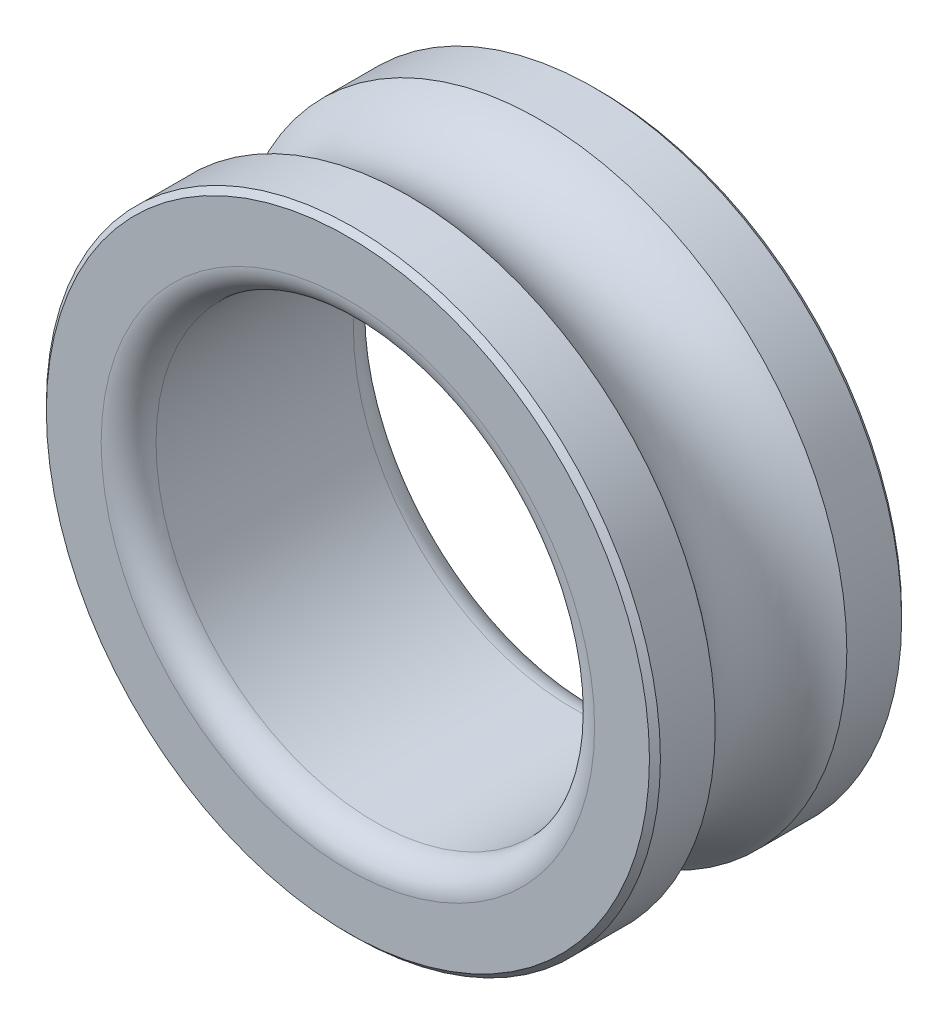
ISO-10303-21;
HEADER;
FILE_DESCRIPTION(('STEP AP214'),'2;1');
FILE_NAME('part.step','',(''),(''),'','','');
FILE_SCHEMA(('AUTOMOTIVE_DESIGN { 1 0 10303 214 1 1 1 1 }'));
ENDSEC;
DATA;
#1=APPLICATION_CONTEXT('core data for automotive mechanical design processes');
#2=APPLICATION_PROTOCOL_DEFINITION('international standard','automotive_design',2000,#1);
#3=PRODUCT_CONTEXT('',#1,'mechanical');
#4=PRODUCT('Part','Part','',(#3));
#5=PRODUCT_RELATED_PRODUCT_CATEGORY('part','',(#4));
#6=PRODUCT_DEFINITION_FORMATION('','',#4);
#7=PRODUCT_DEFINITION_CONTEXT('part definition',#1,'design');
#8=PRODUCT_DEFINITION('design','',#6,#7);
#9=PRODUCT_DEFINITION_SHAPE('','',#8);
#10=(LENGTH_UNIT() NAMED_UNIT(*) SI_UNIT(.MILLI.,.METRE.));
#11=(NAMED_UNIT(*) PLANE_ANGLE_UNIT() SI_UNIT($,.RADIAN.));
#12=(NAMED_UNIT(*) SI_UNIT($,.STERADIAN.) SOLID_ANGLE_UNIT());
#13=UNCERTAINTY_MEASURE_WITH_UNIT(LENGTH_MEASURE(1.E-05),#10,'distance_accuracy_value','');
#14=(GEOMETRIC_REPRESENTATION_CONTEXT(3) GLOBAL_UNCERTAINTY_ASSIGNED_CONTEXT((#13)) GLOBAL_UNIT_ASSIGNED_CONTEXT((#10,
#11,#12)) REPRESENTATION_CONTEXT('',''));
#15=CARTESIAN_POINT('',(0.,0.,0.));
#16=DIRECTION('',(0.,0.,1.));
#17=DIRECTION('',(1.,0.,0.));
#18=AXIS2_PLACEMENT_3D('',#15,#16,#17);
#19=CARTESIAN_POINT('',(0.,0.,11.5));
#20=DIRECTION('',(0.,0.,-1.));
#21=DIRECTION('',(-1.,0.,0.));
#22=AXIS2_PLACEMENT_3D('',#19,#20,#21);
#23=CYLINDRICAL_SURFACE('',#22,28.);
#24=CARTESIAN_POINT('',(0.,0.,11.));
#25=DIRECTION('',(0.,0.,1.));
#26=DIRECTION('',(1.,0.,0.));
#27=AXIS2_PLACEMENT_3D('',#24,#25,#26);
#28=CIRCLE('',#27,28.);
#29=CARTESIAN_POINT('',(28.,0.,11.));
#30=VERTEX_POINT('',#29);
#31=EDGE_CURVE('E70',#30,#30,#28,.F.);
#32=ORIENTED_EDGE('',*,*,#31,.T.);
#33=EDGE_LOOP('',(#32));
#34=FACE_BOUND('',#33,.T.);
#35=CARTESIAN_POINT('',(0.,0.,6.));
#36=DIRECTION('',(0.,0.,-1.));
#37=DIRECTION('',(-1.,0.,0.));
#38=AXIS2_PLACEMENT_3D('',#35,#36,#37);
#39=CIRCLE('',#38,28.);
#40=CARTESIAN_POINT('',(-28.,0.,6.));
#41=VERTEX_POINT('',#40);
#42=EDGE_CURVE('E84',#41,#41,#39,.F.);
#43=ORIENTED_EDGE('',*,*,#42,.T.);
#44=EDGE_LOOP('',(#43));
#45=FACE_BOUND('',#44,.T.);
#46=ADVANCED_FACE('F43',(#34,#45),#23,.T.);
#47=CARTESIAN_POINT('',(0.,0.,11.5));
#48=DIRECTION('',(0.,0.,1.));
#49=DIRECTION('',(1.,0.,0.));
#50=AXIS2_PLACEMENT_3D('',#47,#48,#49);
#51=PLANE('',#50);
#52=CARTESIAN_POINT('',(0.,0.,11.5));
#53=DIRECTION('',(0.,0.,1.));
#54=DIRECTION('',(1.,0.,0.));
#55=AXIS2_PLACEMENT_3D('',#52,#53,#54);
#56=CIRCLE('',#55,22.5);
#57=CARTESIAN_POINT('',(22.5,0.,11.5));
#58=VERTEX_POINT('',#57);
#59=EDGE_CURVE('E11',#58,#58,#56,.F.);
#60=ORIENTED_EDGE('',*,*,#59,.T.);
#61=EDGE_LOOP('',(#60));
#62=FACE_BOUND('',#61,.T.);
#63=CARTESIAN_POINT('',(0.,0.,11.5));
#64=DIRECTION('',(0.,0.,1.));
#65=DIRECTION('',(1.,0.,0.));
#66=AXIS2_PLACEMENT_3D('',#63,#64,#65);
#67=CIRCLE('',#66,27.5);
#68=CARTESIAN_POINT('',(27.5,0.,11.5));
#69=VERTEX_POINT('',#68);
#70=EDGE_CURVE('E74',#69,#69,#67,.T.);
#71=ORIENTED_EDGE('',*,*,#70,.T.);
#72=EDGE_LOOP('',(#71));
#73=FACE_BOUND('',#72,.T.);
#74=ADVANCED_FACE('F103',(#62,#73),#51,.T.);
#75=CARTESIAN_POINT('',(0.,0.,-11.5));
#76=DIRECTION('',(0.,0.,1.));
#77=DIRECTION('',(1.,0.,0.));
#78=AXIS2_PLACEMENT_3D('',#75,#76,#77);
#79=PLANE('',#78);
#80=CARTESIAN_POINT('',(0.,0.,-11.5));
#81=DIRECTION('',(0.,0.,1.));
#82=DIRECTION('',(1.,0.,0.));
#83=AXIS2_PLACEMENT_3D('',#80,#81,#82);
#84=CIRCLE('',#83,22.5);
#85=CARTESIAN_POINT('',(22.5,0.,-11.5));
#86=VERTEX_POINT('',#85);
#87=EDGE_CURVE('E65',#86,#86,#84,.T.);
#88=ORIENTED_EDGE('',*,*,#87,.T.);
#89=EDGE_LOOP('',(#88));
#90=FACE_BOUND('',#89,.T.);
#91=CARTESIAN_POINT('',(0.,0.,-11.5));
#92=DIRECTION('',(0.,0.,1.));
#93=DIRECTION('',(1.,0.,0.));
#94=AXIS2_PLACEMENT_3D('',#91,#92,#93);
#95=CIRCLE('',#94,27.5);
#96=CARTESIAN_POINT('',(27.5,0.,-11.5));
#97=VERTEX_POINT('',#96);
#98=EDGE_CURVE('E77',#97,#97,#95,.F.);
#99=ORIENTED_EDGE('',*,*,#98,.T.);
#100=EDGE_LOOP('',(#99));
#101=FACE_BOUND('',#100,.T.);
#102=ADVANCED_FACE('F109',(#90,#101),#79,.F.);
#103=CARTESIAN_POINT('',(0.,0.,-11.));
#104=DIRECTION('',(0.,0.,1.));
#105=DIRECTION('',(1.,0.,0.));
#106=AXIS2_PLACEMENT_3D('',#103,#104,#105);
#107=CIRCLE('',#106,28.);
#108=CARTESIAN_POINT('',(28.,0.,-11.));
#109=VERTEX_POINT('',#108);
#110=EDGE_CURVE('E80',#109,#109,#107,.T.);
#111=ORIENTED_EDGE('',*,*,#110,.T.);
#112=EDGE_LOOP('',(#111));
#113=FACE_BOUND('',#112,.T.);
#114=CARTESIAN_POINT('',(0.,0.,-6.));
#115=DIRECTION('',(0.,0.,1.));
#116=DIRECTION('',(1.,0.,0.));
#117=AXIS2_PLACEMENT_3D('',#114,#115,#116);
#118=CIRCLE('',#117,28.);
#119=CARTESIAN_POINT('',(28.,0.,-6.));
#120=VERTEX_POINT('',#119);
#121=EDGE_CURVE('E88',#120,#120,#118,.F.);
#122=ORIENTED_EDGE('',*,*,#121,.T.);
#123=EDGE_LOOP('',(#122));
#124=FACE_BOUND('',#123,.T.);
#125=ADVANCED_FACE('F92',(#113,#124),#23,.T.);
#126=CARTESIAN_POINT('',(0.,0.,11.5));
#127=DIRECTION('',(0.,0.,-1.));
#128=DIRECTION('',(-1.,0.,0.));
#129=AXIS2_PLACEMENT_3D('',#126,#127,#128);
#130=CYLINDRICAL_SURFACE('',#129,20.);
#131=CARTESIAN_POINT('',(0.,0.,-9.));
#132=DIRECTION('',(0.,0.,1.));
#133=DIRECTION('',(1.,0.,0.));
#134=AXIS2_PLACEMENT_3D('',#131,#132,#133);
#135=CIRCLE('',#134,20.);
#136=CARTESIAN_POINT('',(20.,0.,-9.));
#137=VERTEX_POINT('',#136);
#138=EDGE_CURVE('E51',#137,#137,#135,.F.);
#139=ORIENTED_EDGE('',*,*,#138,.T.);
#140=EDGE_LOOP('',(#139));
#141=FACE_BOUND('',#140,.T.);
#142=CARTESIAN_POINT('',(0.,0.,9.));
#143=DIRECTION('',(0.,0.,1.));
#144=DIRECTION('',(1.,0.,0.));
#145=AXIS2_PLACEMENT_3D('',#142,#143,#144);
#146=CIRCLE('',#145,20.);
#147=CARTESIAN_POINT('',(20.,0.,9.));
#148=VERTEX_POINT('',#147);
#149=EDGE_CURVE('E58',#148,#148,#146,.T.);
#150=ORIENTED_EDGE('',*,*,#149,.T.);
#151=EDGE_LOOP('',(#150));
#152=FACE_BOUND('',#151,.T.);
#153=ADVANCED_FACE('F98',(#141,#152),#130,.F.);
#154=CARTESIAN_POINT('',(0.,0.,0.));
#155=DIRECTION('',(0.,0.,1.));
#156=DIRECTION('',(1.,0.,0.));
#157=AXIS2_PLACEMENT_3D('',#154,#155,#156);
#158=TOROIDAL_SURFACE('',#157,32.5,7.5);
#159=ORIENTED_EDGE('',*,*,#121,.F.);
#160=EDGE_LOOP('',(#159));
#161=FACE_BOUND('',#160,.T.);
#162=ORIENTED_EDGE('',*,*,#42,.F.);
#163=EDGE_LOOP('',(#162));
#164=FACE_BOUND('',#163,.T.);
#165=ADVANCED_FACE('F94',(#161,#164),#158,.F.);
#166=CARTESIAN_POINT('',(0.,0.,-11.));
#167=DIRECTION('',(0.,0.,1.));
#168=DIRECTION('',(1.,0.,0.));
#169=AXIS2_PLACEMENT_3D('',#166,#167,#168);
#170=CONICAL_SURFACE('',#169,28.,0.785398163397455);
#171=ORIENTED_EDGE('',*,*,#98,.F.);
#172=EDGE_LOOP('',(#171));
#173=FACE_BOUND('',#172,.T.);
#174=ORIENTED_EDGE('',*,*,#110,.F.);
#175=EDGE_LOOP('',(#174));
#176=FACE_BOUND('',#175,.T.);
#177=ADVANCED_FACE('F97',(#173,#176),#170,.T.);
#178=CARTESIAN_POINT('',(0.,0.,11.5));
#179=DIRECTION('',(0.,0.,-1.));
#180=DIRECTION('',(-1.,0.,0.));
#181=AXIS2_PLACEMENT_3D('',#178,#179,#180);
#182=CONICAL_SURFACE('',#181,27.5,0.785398163397452);
#183=ORIENTED_EDGE('',*,*,#31,.F.);
#184=EDGE_LOOP('',(#183));
#185=FACE_BOUND('',#184,.T.);
#186=ORIENTED_EDGE('',*,*,#70,.F.);
#187=EDGE_LOOP('',(#186));
#188=FACE_BOUND('',#187,.T.);
#189=ADVANCED_FACE('F124',(#185,#188),#182,.T.);
#190=CARTESIAN_POINT('',(0.,0.,-9.));
#191=DIRECTION('',(0.,0.,1.));
#192=DIRECTION('',(1.,0.,0.));
#193=AXIS2_PLACEMENT_3D('',#190,#191,#192);
#194=TOROIDAL_SURFACE('',#193,22.5,2.5);
#195=ORIENTED_EDGE('',*,*,#138,.F.);
#196=EDGE_LOOP('',(#195));
#197=FACE_BOUND('',#196,.T.);
#198=ORIENTED_EDGE('',*,*,#87,.F.);
#199=EDGE_LOOP('',(#198));
#200=FACE_BOUND('',#199,.T.);
#201=ADVANCED_FACE('F129',(#197,#200),#194,.T.);
#202=CARTESIAN_POINT('',(0.,0.,9.));
#203=DIRECTION('',(0.,0.,1.));
#204=DIRECTION('',(1.,0.,0.));
#205=AXIS2_PLACEMENT_3D('',#202,#203,#204);
#206=TOROIDAL_SURFACE('',#205,22.5,2.5);
#207=ORIENTED_EDGE('',*,*,#59,.F.);
#208=EDGE_LOOP('',(#207));
#209=FACE_BOUND('',#208,.T.);
#210=ORIENTED_EDGE('',*,*,#149,.F.);
#211=EDGE_LOOP('',(#210));
#212=FACE_BOUND('',#211,.T.);
#213=ADVANCED_FACE('F45',(#209,#212),#206,.T.);
#214=CLOSED_SHELL('',(#46,#74,#102,#125,#153,#165,#177,#189,#201,#213));
#215=MANIFOLD_SOLID_BREP('B2',#214);
#216=ADVANCED_BREP_SHAPE_REPRESENTATION('',(#18,#215),#14);
#217=SHAPE_DEFINITION_REPRESENTATION(#9,#216);
ENDSEC;
END-ISO-10303-21;
